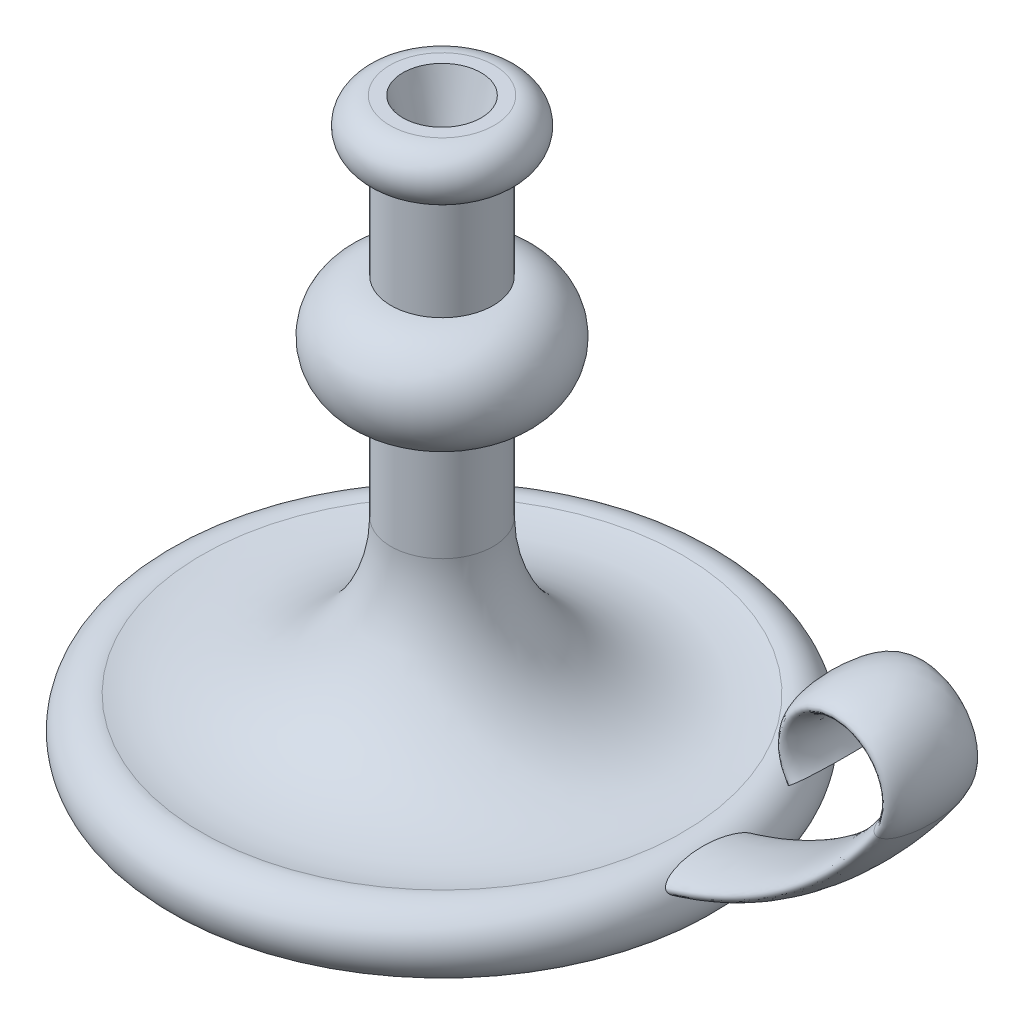
ISO-10303-21;
HEADER;
FILE_DESCRIPTION(('STEP AP214'),'2;1');
FILE_NAME('part.step','',(''),(''),'','','');
FILE_SCHEMA(('AUTOMOTIVE_DESIGN { 1 0 10303 214 1 1 1 1 }'));
ENDSEC;
DATA;
#1=APPLICATION_CONTEXT('core data for automotive mechanical design processes');
#2=APPLICATION_PROTOCOL_DEFINITION('international standard','automotive_design',2000,#1);
#3=PRODUCT_CONTEXT('',#1,'mechanical');
#4=PRODUCT('Part','Part','',(#3));
#5=PRODUCT_RELATED_PRODUCT_CATEGORY('part','',(#4));
#6=PRODUCT_DEFINITION_FORMATION('','',#4);
#7=PRODUCT_DEFINITION_CONTEXT('part definition',#1,'design');
#8=PRODUCT_DEFINITION('design','',#6,#7);
#9=PRODUCT_DEFINITION_SHAPE('','',#8);
#10=(LENGTH_UNIT() NAMED_UNIT(*) SI_UNIT(.MILLI.,.METRE.));
#11=(NAMED_UNIT(*) PLANE_ANGLE_UNIT() SI_UNIT($,.RADIAN.));
#12=(NAMED_UNIT(*) SI_UNIT($,.STERADIAN.) SOLID_ANGLE_UNIT());
#13=UNCERTAINTY_MEASURE_WITH_UNIT(LENGTH_MEASURE(1.E-05),#10,'distance_accuracy_value','');
#14=(GEOMETRIC_REPRESENTATION_CONTEXT(3) GLOBAL_UNCERTAINTY_ASSIGNED_CONTEXT((#13)) GLOBAL_UNIT_ASSIGNED_CONTEXT((#10,
#11,#12)) REPRESENTATION_CONTEXT('',''));
#15=CARTESIAN_POINT('',(0.,0.,0.));
#16=DIRECTION('',(0.,0.,1.));
#17=DIRECTION('',(1.,0.,0.));
#18=AXIS2_PLACEMENT_3D('',#15,#16,#17);
#19=CARTESIAN_POINT('',(0.,0.,0.));
#20=DIRECTION('',(0.,-1.,0.));
#21=DIRECTION('',(0.,0.,-1.));
#22=AXIS2_PLACEMENT_3D('',#19,#20,#21);
#23=PLANE('',#22);
#24=CARTESIAN_POINT('',(0.,0.,0.));
#25=DIRECTION('',(0.,-1.,0.));
#26=DIRECTION('',(0.,0.,-1.));
#27=AXIS2_PLACEMENT_3D('',#24,#25,#26);
#28=CIRCLE('',#27,103.316912972085);
#29=CARTESIAN_POINT('',(0.,0.,-103.316912972085));
#30=VERTEX_POINT('',#29);
#31=EDGE_CURVE('E50',#30,#30,#28,.T.);
#32=ORIENTED_EDGE('',*,*,#31,.T.);
#33=EDGE_LOOP('',(#32));
#34=FACE_BOUND('',#33,.T.);
#35=ADVANCED_FACE('F33',(#34),#23,.T.);
#36=CARTESIAN_POINT('',(0.,220.,0.));
#37=DIRECTION('',(0.,1.,0.));
#38=DIRECTION('',(0.,0.,1.));
#39=AXIS2_PLACEMENT_3D('',#36,#37,#38);
#40=PLANE('',#39);
#41=CARTESIAN_POINT('',(0.,220.,0.));
#42=DIRECTION('',(0.,1.,0.));
#43=DIRECTION('',(0.,0.,1.));
#44=AXIS2_PLACEMENT_3D('',#41,#42,#43);
#45=CIRCLE('',#44,15.);
#46=CARTESIAN_POINT('',(0.,220.,15.));
#47=VERTEX_POINT('',#46);
#48=EDGE_CURVE('E145',#47,#47,#45,.T.);
#49=ORIENTED_EDGE('',*,*,#48,.F.);
#50=EDGE_LOOP('',(#49));
#51=FACE_BOUND('',#50,.T.);
#52=CARTESIAN_POINT('',(0.,220.,0.));
#53=DIRECTION('',(0.,-1.,0.));
#54=DIRECTION('',(0.,0.,-1.));
#55=AXIS2_PLACEMENT_3D('',#52,#53,#54);
#56=CIRCLE('',#55,20.);
#57=CARTESIAN_POINT('',(0.,220.,-20.));
#58=VERTEX_POINT('',#57);
#59=EDGE_CURVE('E43',#58,#58,#56,.T.);
#60=ORIENTED_EDGE('',*,*,#59,.F.);
#61=EDGE_LOOP('',(#60));
#62=FACE_BOUND('',#61,.T.);
#63=ADVANCED_FACE('F80',(#51,#62),#40,.T.);
#64=CARTESIAN_POINT('',(0.,210.,0.));
#65=DIRECTION('',(0.,-1.,0.));
#66=DIRECTION('',(0.,0.,-1.));
#67=AXIS2_PLACEMENT_3D('',#64,#65,#66);
#68=TOROIDAL_SURFACE('',#67,20.,10.);
#69=ORIENTED_EDGE('',*,*,#59,.T.);
#70=EDGE_LOOP('',(#69));
#71=FACE_BOUND('',#70,.T.);
#72=CARTESIAN_POINT('',(0.,200.008061282712,0.));
#73=DIRECTION('',(0.,-1.,0.));
#74=DIRECTION('',(0.,0.,-1.));
#75=AXIS2_PLACEMENT_3D('',#72,#73,#74);
#76=CIRCLE('',#75,19.5985517842088);
#77=CARTESIAN_POINT('',(0.,200.008061282712,-19.5985517842088));
#78=VERTEX_POINT('',#77);
#79=EDGE_CURVE('E72',#78,#78,#76,.T.);
#80=ORIENTED_EDGE('',*,*,#79,.F.);
#81=EDGE_LOOP('',(#80));
#82=FACE_BOUND('',#81,.T.);
#83=ADVANCED_FACE('F77',(#71,#82),#68,.T.);
#84=CARTESIAN_POINT('',(0.,0.,0.));
#85=DIRECTION('',(0.,-1.,0.));
#86=DIRECTION('',(0.,0.,-1.));
#87=AXIS2_PLACEMENT_3D('',#84,#85,#86);
#88=CYLINDRICAL_SURFACE('',#87,19.5985517842088);
#89=ORIENTED_EDGE('',*,*,#79,.T.);
#90=EDGE_LOOP('',(#89));
#91=FACE_BOUND('',#90,.T.);
#92=CARTESIAN_POINT('',(0.,160.008061282712,0.));
#93=DIRECTION('',(0.,-1.,0.));
#94=DIRECTION('',(0.,0.,-1.));
#95=AXIS2_PLACEMENT_3D('',#92,#93,#94);
#96=CIRCLE('',#95,19.5985517842088);
#97=CARTESIAN_POINT('',(0.,160.008061282712,-19.5985517842088));
#98=VERTEX_POINT('',#97);
#99=EDGE_CURVE('E69',#98,#98,#96,.T.);
#100=ORIENTED_EDGE('',*,*,#99,.F.);
#101=EDGE_LOOP('',(#100));
#102=FACE_BOUND('',#101,.T.);
#103=ADVANCED_FACE('F87',(#91,#102),#88,.T.);
#104=CARTESIAN_POINT('',(0.,140.008061282712,0.));
#105=DIRECTION('',(0.,-1.,0.));
#106=DIRECTION('',(0.,0.,-1.));
#107=AXIS2_PLACEMENT_3D('',#104,#105,#106);
#108=DEGENERATE_TOROIDAL_SURFACE('',#107,19.5985517842088,20.,.T.);
#109=ORIENTED_EDGE('',*,*,#99,.T.);
#110=EDGE_LOOP('',(#109));
#111=FACE_BOUND('',#110,.T.);
#112=CARTESIAN_POINT('',(0.,120.008061282712,0.));
#113=DIRECTION('',(0.,-1.,0.));
#114=DIRECTION('',(0.,0.,-1.));
#115=AXIS2_PLACEMENT_3D('',#112,#113,#114);
#116=CIRCLE('',#115,19.5985517842088);
#117=CARTESIAN_POINT('',(0.,120.008061282712,-19.5985517842088));
#118=VERTEX_POINT('',#117);
#119=EDGE_CURVE('E66',#118,#118,#116,.T.);
#120=ORIENTED_EDGE('',*,*,#119,.F.);
#121=EDGE_LOOP('',(#120));
#122=FACE_BOUND('',#121,.T.);
#123=ADVANCED_FACE('F94',(#111,#122),#108,.T.);
#124=CARTESIAN_POINT('',(0.,0.,0.));
#125=DIRECTION('',(0.,-1.,0.));
#126=DIRECTION('',(0.,0.,-1.));
#127=AXIS2_PLACEMENT_3D('',#124,#125,#126);
#128=CYLINDRICAL_SURFACE('',#127,19.5985517842088);
#129=ORIENTED_EDGE('',*,*,#119,.T.);
#130=EDGE_LOOP('',(#129));
#131=FACE_BOUND('',#130,.T.);
#132=CARTESIAN_POINT('',(0.,80.008061282712,0.));
#133=DIRECTION('',(0.,-1.,0.));
#134=DIRECTION('',(0.,0.,-1.));
#135=AXIS2_PLACEMENT_3D('',#132,#133,#134);
#136=CIRCLE('',#135,19.5985517842088);
#137=CARTESIAN_POINT('',(0.,80.008061282712,-19.5985517842088));
#138=VERTEX_POINT('',#137);
#139=EDGE_CURVE('E63',#138,#138,#136,.T.);
#140=ORIENTED_EDGE('',*,*,#139,.F.);
#141=EDGE_LOOP('',(#140));
#142=FACE_BOUND('',#141,.T.);
#143=ADVANCED_FACE('F98',(#131,#142),#128,.T.);
#144=CARTESIAN_POINT('',(0.,80.0080612827121,0.));
#145=DIRECTION('',(0.,-1.,0.));
#146=DIRECTION('',(0.,0.,-1.));
#147=AXIS2_PLACEMENT_3D('',#144,#145,#146);
#148=TOROIDAL_SURFACE('',#147,79.5985517842088,60.);
#149=ORIENTED_EDGE('',*,*,#139,.T.);
#150=EDGE_LOOP('',(#149));
#151=FACE_BOUND('',#150,.T.);
#152=CARTESIAN_POINT('',(0.,21.334474768236,0.));
#153=DIRECTION('',(0.,-1.,0.));
#154=DIRECTION('',(0.,0.,-1.));
#155=AXIS2_PLACEMENT_3D('',#152,#153,#154);
#156=CIRCLE('',#155,92.1448757688783);
#157=CARTESIAN_POINT('',(0.,21.334474768236,-92.1448757688783));
#158=VERTEX_POINT('',#157);
#159=EDGE_CURVE('E54',#158,#158,#156,.T.);
#160=ORIENTED_EDGE('',*,*,#159,.F.);
#161=EDGE_LOOP('',(#160));
#162=FACE_BOUND('',#161,.T.);
#163=ADVANCED_FACE('F102',(#151,#162),#148,.F.);
#164=CARTESIAN_POINT('',(0.,9.11081091105351,0.));
#165=DIRECTION('',(0.,-1.,0.));
#166=DIRECTION('',(0.,0.,-1.));
#167=AXIS2_PLACEMENT_3D('',#164,#165,#166);
#168=TOROIDAL_SURFACE('',#167,94.7586932656845,12.5);
#169=CARTESIAN_POINT('',(103.426266730433,16.4236810687177,-17.5));
#170=CARTESIAN_POINT('',(103.397269027775,16.463316378507,-17.5000027204003));
#171=CARTESIAN_POINT('',(103.368293788167,16.5029522137003,-17.4977396373189));
#172=CARTESIAN_POINT('',(103.310598700613,16.5819120229062,-17.4887733293129));
#173=CARTESIAN_POINT('',(103.281878904488,16.6212359334727,-17.482069223381));
#174=CARTESIAN_POINT('',(103.196372047125,16.7383326956763,-17.4555385289255));
#175=CARTESIAN_POINT('',(103.140260272071,16.8151994351432,-17.4292937889514));
#176=CARTESIAN_POINT('',(103.015609748354,16.9857964370289,-17.3528768518307));
#177=CARTESIAN_POINT('',(102.948073526571,17.0781078578915,-17.2980232574553));
#178=CARTESIAN_POINT('',(102.818708637101,17.2544090594567,-17.1709984554719));
#179=CARTESIAN_POINT('',(102.756892890607,17.3383800309684,-17.0987893074066));
#180=CARTESIAN_POINT('',(102.646223440756,17.4880641679665,-16.9522633950317));
#181=CARTESIAN_POINT('',(102.596721606566,17.5547405587344,-16.8793865390805));
#182=CARTESIAN_POINT('',(102.501317376787,17.6826479266324,-16.7267565624448));
#183=CARTESIAN_POINT('',(102.455417980281,17.7438743721703,-16.6469978260516));
#184=CARTESIAN_POINT('',(102.366669057382,17.861624856974,-16.4821656614054));
#185=CARTESIAN_POINT('',(102.323827314502,17.9181369531157,-16.3970796370681));
#186=CARTESIAN_POINT('',(102.240892600228,18.0268841083852,-16.2230006309145));
#187=CARTESIAN_POINT('',(102.20079872388,18.0791205767162,-16.1340089513387));
#188=CARTESIAN_POINT('',(102.123361622276,18.1793604534935,-15.9538516229895));
#189=CARTESIAN_POINT('',(102.085994992371,18.2274008176284,-15.862716425842));
#190=CARTESIAN_POINT('',(102.013279226942,18.3202544146931,-15.6780212762858));
#191=CARTESIAN_POINT('',(101.977930435079,18.3650670982511,-15.5844609147667));
#192=CARTESIAN_POINT('',(101.874430290289,18.495344772413,-15.3005590379703));
#193=CARTESIAN_POINT('',(101.808938159428,18.5765033716367,-15.1072661773267));
#194=CARTESIAN_POINT('',(101.68353129244,18.7296038666987,-14.7151797783787));
#195=CARTESIAN_POINT('',(101.623621353623,18.8015378545612,-14.5163816957818));
#196=CARTESIAN_POINT('',(101.508171044834,18.9379973073709,-14.1139806525515));
#197=CARTESIAN_POINT('',(101.452651122625,19.0024886806834,-13.9103603606587));
#198=CARTESIAN_POINT('',(101.345613790074,19.1248107821751,-13.5003692184341));
#199=CARTESIAN_POINT('',(101.294092050806,19.1826487478438,-13.2940016346093));
#200=CARTESIAN_POINT('',(101.19448293199,19.2926263123995,-12.8790016001586));
#201=CARTESIAN_POINT('',(101.146394707163,19.3447673154787,-12.6703697216387));
#202=CARTESIAN_POINT('',(101.045067004893,19.4528080053435,-12.2143560424825));
#203=CARTESIAN_POINT('',(100.992411292707,19.5077531032332,-11.9666192078632));
#204=CARTESIAN_POINT('',(100.890887417472,19.6116376131444,-11.4691099180631));
#205=CARTESIAN_POINT('',(100.842019539576,19.6605765731779,-11.219337311188));
#206=CARTESIAN_POINT('',(100.747769000577,19.7531545475027,-10.7180433319723));
#207=CARTESIAN_POINT('',(100.702387901273,19.7967911918083,-10.4665212303728));
#208=CARTESIAN_POINT('',(100.614949671447,19.8792887281544,-9.9621158572137));
#209=CARTESIAN_POINT('',(100.572892682826,19.9181494163573,-9.70923252803747));
#210=CARTESIAN_POINT('',(100.451783826594,20.0280246589682,-8.95050446077015));
#211=CARTESIAN_POINT('',(100.377491351028,20.092625216391,-8.44295862786832));
#212=CARTESIAN_POINT('',(100.241315995894,20.2073850333109,-7.42458093626869));
#213=CARTESIAN_POINT('',(100.179433909812,20.2575433695031,-6.91374886961223));
#214=CARTESIAN_POINT('',(100.096128769927,20.3232918256759,-6.14621311435612));
#215=CARTESIAN_POINT('',(100.069968310303,20.3436107538037,-5.89041171021286));
#216=CARTESIAN_POINT('',(100.020838245978,20.3812851644509,-5.37830363237506));
#217=CARTESIAN_POINT('',(99.9978684122739,20.3986408596733,-5.1219969962835));
#218=CARTESIAN_POINT('',(99.9338188592132,20.4465042050169,-4.35237405832747));
#219=CARTESIAN_POINT('',(99.8976016024752,20.4728061668091,-3.83837782229187));
#220=CARTESIAN_POINT('',(99.8385704386688,20.5151096031763,-2.80896721877596));
#221=CARTESIAN_POINT('',(99.815762729484,20.5311063149984,-2.29355230598237));
#222=CARTESIAN_POINT('',(99.7839247970312,20.5533159164935,-1.26209443794372));
#223=CARTESIAN_POINT('',(99.7748942885946,20.5595290086737,-0.746051495919245));
#224=CARTESIAN_POINT('',(99.7707625480538,20.5623800825022,0.285979152847147));
#225=CARTESIAN_POINT('',(99.775657633349,20.559020595603,0.801966838112897));
#226=CARTESIAN_POINT('',(99.7992859696937,20.5426194903898,1.8334828307293));
#227=CARTESIAN_POINT('',(99.8180195056095,20.5295776727638,2.34901112840467));
#228=CARTESIAN_POINT('',(99.869025492416,20.4933751965346,3.37898886111217));
#229=CARTESIAN_POINT('',(99.9012965975955,20.4702155436921,3.89343839827218));
#230=CARTESIAN_POINT('',(99.978943306834,20.412996207485,4.92072664822215));
#231=CARTESIAN_POINT('',(100.024318273987,20.3789370538758,5.43356543807724));
#232=CARTESIAN_POINT('',(100.111004309299,20.3117017632972,6.29141281224848));
#233=CARTESIAN_POINT('',(100.148879454705,20.2818060114869,6.63703175681123));
#234=CARTESIAN_POINT('',(100.230331590307,20.2159790171395,7.32701952039132));
#235=CARTESIAN_POINT('',(100.273908452677,20.1800479099034,7.67138836725669));
#236=CARTESIAN_POINT('',(100.366715409076,20.101542158752,8.35847890378055));
#237=CARTESIAN_POINT('',(100.415943462604,20.0589699108009,8.70120114170874));
#238=CARTESIAN_POINT('',(100.520133054679,19.9663853347988,9.38476334121921));
#239=CARTESIAN_POINT('',(100.575094387713,19.9163732734026,9.72560336980896));
#240=CARTESIAN_POINT('',(100.677014088296,19.8209597702579,10.323063917175));
#241=CARTESIAN_POINT('',(100.722709344399,19.7773515157925,10.5801866669277));
#242=CARTESIAN_POINT('',(100.817717660682,19.6846928513083,11.0927745726166));
#243=CARTESIAN_POINT('',(100.867030569689,19.6356426686483,11.348239797331));
#244=CARTESIAN_POINT('',(100.969597448888,19.531353490375,11.8573209261919));
#245=CARTESIAN_POINT('',(101.022854331221,19.4761099059115,12.1109353088327));
#246=CARTESIAN_POINT('',(101.13369733211,19.3585639025338,12.6155599153797));
#247=CARTESIAN_POINT('',(101.191282968465,19.2962622694602,12.8665704258098));
#248=CARTESIAN_POINT('',(101.291544708287,19.1853816696112,13.2826923171309));
#249=CARTESIAN_POINT('',(101.33284884938,19.1390838133859,13.448742685507));
#250=CARTESIAN_POINT('',(101.417955829538,19.0423162713613,13.7790100910031));
#251=CARTESIAN_POINT('',(101.461758982197,18.9918460616252,13.9432268949282));
#252=CARTESIAN_POINT('',(101.55222997361,18.8861354037197,14.2694495040369));
#253=CARTESIAN_POINT('',(101.598899565364,18.8308920279011,14.4314538806599));
#254=CARTESIAN_POINT('',(101.695642450451,18.7148052528743,14.7528675305471));
#255=CARTESIAN_POINT('',(101.745723034638,18.6539497531057,14.9122702808969));
#256=CARTESIAN_POINT('',(101.849784734008,18.5258275728738,15.227106896501));
#257=CARTESIAN_POINT('',(101.903763981255,18.4585639578177,15.3825426147669));
#258=CARTESIAN_POINT('',(102.016422360045,18.3164253276209,15.6880001825387));
#259=CARTESIAN_POINT('',(102.075096672158,18.241558096774,15.8380273600294));
#260=CARTESIAN_POINT('',(102.183547382769,18.1015813085526,16.0955043221229));
#261=CARTESIAN_POINT('',(102.232083547579,18.038436952378,16.2045370831579));
#262=CARTESIAN_POINT('',(102.333263768204,17.9057614238499,16.4168598886759));
#263=CARTESIAN_POINT('',(102.385911009762,17.8362252908603,16.5201453712018));
#264=CARTESIAN_POINT('',(102.495622517432,17.6903050018945,16.7177791494335));
#265=CARTESIAN_POINT('',(102.552646452482,17.6139825397244,16.8121945669929));
#266=CARTESIAN_POINT('',(102.672285665462,17.452930164333,16.9894770290263));
#267=CARTESIAN_POINT('',(102.734888442554,17.3682190029983,17.0723688778794));
#268=CARTESIAN_POINT('',(102.851846979412,17.2092931036569,17.2050196439126));
#269=CARTESIAN_POINT('',(102.90495253331,17.1369171394966,17.2580496288019));
#270=CARTESIAN_POINT('',(103.015069116115,16.9865355209552,17.3507488476699));
#271=CARTESIAN_POINT('',(103.072078913573,16.9085316412797,17.3904222713359));
#272=CARTESIAN_POINT('',(103.160240863489,16.7878229973279,17.4373197736977));
#273=CARTESIAN_POINT('',(103.190259852742,16.7467085435173,17.4508933252382));
#274=CARTESIAN_POINT('',(103.250905159123,16.6636515259587,17.4732803632079));
#275=CARTESIAN_POINT('',(103.28153115928,16.621709394459,17.4820962694746));
#276=CARTESIAN_POINT('',(103.3431399908,16.5373708591327,17.4946697444343));
#277=CARTESIAN_POINT('',(103.374122579555,16.4949747653913,17.4984305684184));
#278=CARTESIAN_POINT('',(103.436185968198,16.4101129676613,17.5007726207508));
#279=CARTESIAN_POINT('',(103.467266759927,16.3676472695897,17.4993542686517));
#280=CARTESIAN_POINT('',(103.525771505066,16.2877993863939,17.4918389741755));
#281=CARTESIAN_POINT('',(103.553215652225,16.2503798604789,17.4862830608146));
#282=CARTESIAN_POINT('',(103.607776509149,16.1760763300611,17.4712900185556));
#283=CARTESIAN_POINT('',(103.634893112261,16.139192499238,17.4618516587666));
#284=CARTESIAN_POINT('',(103.715513133278,16.029688414833,17.4280519421525));
#285=CARTESIAN_POINT('',(103.768300387542,15.9581969613617,17.3982040149427));
#286=CARTESIAN_POINT('',(103.893484134258,15.7892376308359,17.3107443631975));
#287=CARTESIAN_POINT('',(103.964383342627,15.6940511542135,17.2467007956413));
#288=CARTESIAN_POINT('',(104.099925586931,15.5130856769054,17.1010394847144));
#289=CARTESIAN_POINT('',(104.164549590836,15.4273351958757,17.0193705596786));
#290=CARTESIAN_POINT('',(104.282308812361,15.2719887198903,16.8520354204313));
#291=CARTESIAN_POINT('',(104.335954318402,15.2016326908719,16.7674119214487));
#292=CARTESIAN_POINT('',(104.439060154809,15.0671373409159,16.5909131336467));
#293=CARTESIAN_POINT('',(104.488516653718,15.0030037036296,16.4990313513699));
#294=CARTESIAN_POINT('',(104.583854015246,14.8800348506832,16.3097907535667));
#295=CARTESIAN_POINT('',(104.629728274734,14.8212093899137,16.2124223678276));
#296=CARTESIAN_POINT('',(104.718285239137,14.708249497945,16.013675714403));
#297=CARTESIAN_POINT('',(104.760968946401,14.654113592612,15.9122987215004));
#298=CARTESIAN_POINT('',(104.849782907617,14.5420495596676,15.6909268046193));
#299=CARTESIAN_POINT('',(104.895466593179,14.4847748689263,15.5704241702876));
#300=CARTESIAN_POINT('',(104.983681546239,14.3748068757641,15.3262195055494));
#301=CARTESIAN_POINT('',(105.026212418054,14.3221141482421,15.2025170761836));
#302=CARTESIAN_POINT('',(105.108444216181,14.2207937759595,14.9528032460934));
#303=CARTESIAN_POINT('',(105.148149679007,14.1721595920157,14.8267959746771));
#304=CARTESIAN_POINT('',(105.225117926284,14.0783801369926,14.5727722009018));
#305=CARTESIAN_POINT('',(105.262380859199,14.0332346538317,14.4447558212487));
#306=CARTESIAN_POINT('',(105.347105330629,13.9311066179654,14.1429615539003));
#307=CARTESIAN_POINT('',(105.393691662149,13.8753620478979,13.9685194138759));
#308=CARTESIAN_POINT('',(105.483418469447,13.7686766679192,13.6172838701517));
#309=CARTESIAN_POINT('',(105.526558478966,13.7177365078378,13.440490152064));
#310=CARTESIAN_POINT('',(105.609805305499,13.6200262370194,13.0848368330723));
#311=CARTESIAN_POINT('',(105.649908814756,13.57326066415,12.9059752171498));
#312=CARTESIAN_POINT('',(105.727326985103,13.4834923238032,12.5467066223342));
#313=CARTESIAN_POINT('',(105.764641474097,13.4404897884972,12.3662995488426));
#314=CARTESIAN_POINT('',(105.872802042634,13.3165010796512,11.8229949827269));
#315=CARTESIAN_POINT('',(105.939828567529,13.240576634711,11.4581732123538));
#316=CARTESIAN_POINT('',(106.065415415038,13.0995908398837,10.7230875471275));
#317=CARTESIAN_POINT('',(106.123931465323,13.0345860415106,10.3528055103551));
#318=CARTESIAN_POINT('',(106.233027561043,12.9143467277316,9.60979384232904));
#319=CARTESIAN_POINT('',(106.283613384244,12.859105095353,9.2370662011071));
#320=CARTESIAN_POINT('',(106.37758784517,12.7571785663278,8.48961212987622));
#321=CARTESIAN_POINT('',(106.42097758457,12.7104923597829,8.11488601490468));
#322=CARTESIAN_POINT('',(106.498311130054,12.6277638932862,7.38976660413014));
#323=CARTESIAN_POINT('',(106.532700158882,12.5912094353011,7.03947866741293));
#324=CARTESIAN_POINT('',(106.595988760591,12.5242440515384,6.33781707855791));
#325=CARTESIAN_POINT('',(106.624888126365,12.4938333575415,5.98644338596624));
#326=CARTESIAN_POINT('',(106.703723577752,12.4111775018163,4.93090955827087));
#327=CARTESIAN_POINT('',(106.745783800592,12.367522583066,4.2254625025432));
#328=CARTESIAN_POINT('',(106.810017529666,12.3010844943769,2.81470459304569));
#329=CARTESIAN_POINT('',(106.83224580151,12.2782438424201,2.10939877522954));
#330=CARTESIAN_POINT('',(106.857571378728,12.2522321210181,0.698167411329047));
#331=CARTESIAN_POINT('',(106.860671430198,12.249058228163,-0.00775803124629848));
#332=CARTESIAN_POINT('',(106.850000505882,12.2600100880334,-1.17921016494105));
#333=CARTESIAN_POINT('',(106.841608242769,12.2686199100988,-1.64485236224872));
#334=CARTESIAN_POINT('',(106.816427151594,12.2945248638375,-2.57566637530312));
#335=CARTESIAN_POINT('',(106.799638518293,12.3118197940538,-3.04083820170966));
#336=CARTESIAN_POINT('',(106.757470692879,12.3554344884873,-3.97055382272103));
#337=CARTESIAN_POINT('',(106.732088120651,12.3817578037476,-4.4350972978969));
#338=CARTESIAN_POINT('',(106.672431791985,12.4439624429258,-5.3629690067159));
#339=CARTESIAN_POINT('',(106.638158344665,12.4798434345446,-5.82629728204334));
#340=CARTESIAN_POINT('',(106.571902466304,12.5496913553013,-6.61305586938988));
#341=CARTESIAN_POINT('',(106.542295284656,12.5810268904458,-6.93692241518866));
#342=CARTESIAN_POINT('',(106.478269221739,12.6491627344655,-7.58360136238959));
#343=CARTESIAN_POINT('',(106.44385045936,12.685962908314,-7.90641378963682));
#344=CARTESIAN_POINT('',(106.369943081655,12.7654808054506,-8.5505676630202));
#345=CARTESIAN_POINT('',(106.330456960132,12.8081956187744,-8.8719097527264));
#346=CARTESIAN_POINT('',(106.246043890667,12.9001618047029,-9.51293955876198));
#347=CARTESIAN_POINT('',(106.201117139896,12.9494129404341,-9.83262733460698));
#348=CARTESIAN_POINT('',(106.11951844071,13.0395858554011,-10.3755890812921));
#349=CARTESIAN_POINT('',(106.084338668067,13.0786587371043,-10.5993953422548));
#350=CARTESIAN_POINT('',(106.010831273147,13.160792884775,-11.0457534181776));
#351=CARTESIAN_POINT('',(105.972503747889,13.2038540278247,-11.2683052715743));
#352=CARTESIAN_POINT('',(105.892400823009,13.2944366865694,-11.7120899835656));
#353=CARTESIAN_POINT('',(105.850622432289,13.34196207673,-11.9333215158527));
#354=CARTESIAN_POINT('',(105.763312397957,13.4419826111856,-12.3739131787332));
#355=CARTESIAN_POINT('',(105.717780870557,13.4944776016087,-12.5932733670392));
#356=CARTESIAN_POINT('',(105.622125538155,13.6056010622947,-13.031519473973));
#357=CARTESIAN_POINT('',(105.571965838019,13.664278080871,-13.2503853465152));
#358=CARTESIAN_POINT('',(105.466812567455,13.7883050689228,-13.68504181303));
#359=CARTESIAN_POINT('',(105.411819463315,13.8536543948054,-13.9008327013237));
#360=CARTESIAN_POINT('',(105.296274102938,13.9921844397436,-14.3281274110939));
#361=CARTESIAN_POINT('',(105.235727819613,14.0653567582272,-14.539635546826));
#362=CARTESIAN_POINT('',(105.107968770756,14.2212381394235,-14.9570314618605));
#363=CARTESIAN_POINT('',(105.040759015896,14.3039428979344,-15.1629217262768));
#364=CARTESIAN_POINT('',(104.934113416829,14.4365300709634,-15.4646873937406));
#365=CARTESIAN_POINT('',(104.897779505335,14.4819116788238,-15.5636434357823));
#366=CARTESIAN_POINT('',(104.82283579274,14.5759966711992,-15.759078203743));
#367=CARTESIAN_POINT('',(104.784226344099,14.6246995414625,-15.8555573100115));
#368=CARTESIAN_POINT('',(104.704397290963,14.7259278148932,-16.0455030344807));
#369=CARTESIAN_POINT('',(104.66317568594,14.7784561525154,-16.1389672590058));
#370=CARTESIAN_POINT('',(104.577788853548,14.8878516378872,-16.3219318272102));
#371=CARTESIAN_POINT('',(104.533624322763,14.9447177593494,-16.4114331006233));
#372=CARTESIAN_POINT('',(104.45332482805,15.0486798466345,-16.5636310900247));
#373=CARTESIAN_POINT('',(104.417925521736,15.0946871091599,-16.6274570741899));
#374=CARTESIAN_POINT('',(104.345020710829,15.1898286343045,-16.7514609866341));
#375=CARTESIAN_POINT('',(104.307515837757,15.2389619599069,-16.8116399976075));
#376=CARTESIAN_POINT('',(104.230243667327,15.3406068339389,-16.9273437976006));
#377=CARTESIAN_POINT('',(104.190480275401,15.3931125702006,-16.982876233451));
#378=CARTESIAN_POINT('',(104.108477910085,15.5018264767327,-17.0881402179593));
#379=CARTESIAN_POINT('',(104.066240548012,15.558032240036,-17.1378754806087));
#380=CARTESIAN_POINT('',(103.968883249859,15.6880837005506,-17.2409102657256));
#381=CARTESIAN_POINT('',(103.91307189245,15.7629665044606,-17.2922910390389));
#382=CARTESIAN_POINT('',(103.797745367662,15.9183675401614,-17.3801295867417));
#383=CARTESIAN_POINT('',(103.738238945277,15.9988725185386,-17.4166211562361));
#384=CARTESIAN_POINT('',(103.636380024039,16.1371474651415,-17.4621517598684));
#385=CARTESIAN_POINT('',(103.594746527409,16.1937910655717,-17.4762599405278));
#386=CARTESIAN_POINT('',(103.510815024174,16.3081831130282,-17.4951819658534));
#387=CARTESIAN_POINT('',(103.468517033738,16.3659315331791,-17.4999960363157));
#388=CARTESIAN_POINT('',(103.426266730433,16.4236810687177,-17.5));
#389=B_SPLINE_CURVE_WITH_KNOTS('',3,(#169,#170,#171,#172,#173,#174,#175,#176,#177,#178,#179,
#180,#181,#182,#183,#184,#185,#186,#187,#188,#189,#190,#191,#192,#193,#194,#195,#196,#197,#198,
#199,#200,#201,#202,#203,#204,#205,#206,#207,#208,#209,#210,#211,#212,#213,#214,#215,#216,#217,
#218,#219,#220,#221,#222,#223,#224,#225,#226,#227,#228,#229,#230,#231,#232,#233,#234,#235,#236,
#237,#238,#239,#240,#241,#242,#243,#244,#245,#246,#247,#248,#249,#250,#251,#252,#253,#254,#255,
#256,#257,#258,#259,#260,#261,#262,#263,#264,#265,#266,#267,#268,#269,#270,#271,#272,#273,#274,
#275,#276,#277,#278,#279,#280,#281,#282,#283,#284,#285,#286,#287,#288,#289,#290,#291,#292,#293,
#294,#295,#296,#297,#298,#299,#300,#301,#302,#303,#304,#305,#306,#307,#308,#309,#310,#311,#312,
#313,#314,#315,#316,#317,#318,#319,#320,#321,#322,#323,#324,#325,#326,#327,#328,#329,#330,#331,
#332,#333,#334,#335,#336,#337,#338,#339,#340,#341,#342,#343,#344,#345,#346,#347,#348,#349,#350,
#351,#352,#353,#354,#355,#356,#357,#358,#359,#360,#361,#362,#363,#364,#365,#366,#367,#368,#369,
#370,#371,#372,#373,#374,#375,#376,#377,#378,#379,#380,#381,#382,#383,#384,#385,#386,#387,#388),
.UNSPECIFIED.,.T.,.F.,(4,2,2,2,2,2,2,2,2,2,2,2,2,2,2,2,2,2,2,2,2,2,2,2,2,2,2,2,2,2,2,2,2,2,2,2,
2,2,2,2,2,2,2,2,2,2,2,2,2,2,2,2,2,2,2,2,2,2,2,2,2,2,2,2,2,2,2,2,2,2,2,2,2,2,2,2,2,2,2,2,2,2,2,2,
2,2,2,2,2,2,2,2,2,2,2,2,2,2,2,2,2,2,2,2,2,2,2,2,2,4),(0.,0.147253694078667,0.294536609012006,
0.589216454817124,0.9676767708968,1.34697207558169,1.6779564665065,2.00921354684322,
2.34128582987067,2.6732482208245,3.00190672488033,3.33062103715896,3.98902707539124,
4.64799382439439,5.30986834294594,5.97101593524086,6.63200019793815,7.40936285594839,
8.18678397805833,8.96455131718008,9.74235183987066,11.2929269025023,12.8436010728859,
13.6173800093452,14.391103380043,15.9386200262316,17.4868513723862,19.0350506718998,
20.5828405906893,22.1306623718136,23.6783303271262,25.2259230715584,26.2727471084855,
27.3195476807625,28.3659714622045,29.4123577471811,30.2065866186487,31.0007823204486,
31.7955704004451,32.5902700758382,33.121996829645,33.6537904559294,34.1859126084106,
34.719210186819,35.2522539240806,35.7847573494181,36.1895680201908,36.5946955593615,
36.9964572560053,37.397340311616,37.7093149868836,38.0211917105281,38.1790587068354,
38.3368453328451,38.4945303011884,38.6522024961366,38.7922395449649,38.9323210253996,
39.2124154145415,39.6147608706321,40.0182907935125,40.385042584658,40.7521262808137,
41.1198713874407,41.4875004729095,41.9103981370646,42.3333487858673,42.7556042557643,
43.1778340360843,43.744596332362,44.3114351775632,44.8788828707633,45.4463655496153,
46.5818366558235,47.723018125896,48.8633642562247,50.0035356450736,51.0650246913299,
52.1265537760301,54.249993483072,56.3675510322173,58.4848045723763,59.882058622431,
61.279280263734,62.6770520914634,64.0747753281463,65.0548725137725,66.0349454860034,
67.0145379707139,67.9940949651007,68.6837407397324,69.3733652666354,70.0635939397209,
70.7538012484818,71.4499025242462,72.1459367192443,72.8412308588645,73.5362122718353,
73.8804432230029,74.2246209952507,74.5690656195365,74.9134290020485,75.1721254971184,
75.4307448116393,75.6889297858781,75.9469484325993,76.2657279014349,76.5837797334825,
76.7983368818631,77.0128888176142),.UNSPECIFIED.);
#390=CARTESIAN_POINT('',(103.426266730433,16.4236810687177,-17.5));
#391=VERTEX_POINT('',#390);
#392=EDGE_CURVE('E11',#391,#391,#389,.T.);
#393=ORIENTED_EDGE('',*,*,#392,.F.);
#394=EDGE_LOOP('',(#393));
#395=FACE_BOUND('',#394,.T.);
#396=ORIENTED_EDGE('',*,*,#159,.T.);
#397=EDGE_LOOP('',(#396));
#398=FACE_BOUND('',#397,.T.);
#399=ORIENTED_EDGE('',*,*,#31,.F.);
#400=EDGE_LOOP('',(#399));
#401=FACE_BOUND('',#400,.T.);
#402=ADVANCED_FACE('F105',(#395,#398,#401),#168,.T.);
#403=CARTESIAN_POINT('',(150.634185358261,75.,0.));
#404=DIRECTION('',(0.566666666666666,-0.823947139620552,0.));
#405=DIRECTION('',(0.,0.,-1.));
#406=AXIS2_PLACEMENT_3D('',#403,#404,#405);
#407=PLANE('',#406);
#408=CARTESIAN_POINT('',(150.634185358261,75.,0.));
#409=DIRECTION('',(0.566666666666666,-0.823947139620552,0.));
#410=DIRECTION('',(0.,0.,-1.));
#411=AXIS2_PLACEMENT_3D('',#408,#409,#410);
#412=ELLIPSE('',#411,17.5,5.);
#413=CARTESIAN_POINT('',(150.634185358261,75.,-17.5));
#414=VERTEX_POINT('',#413);
#415=EDGE_CURVE('E47',#414,#414,#412,.T.);
#416=ORIENTED_EDGE('',*,*,#415,.T.);
#417=EDGE_LOOP('',(#416));
#418=FACE_BOUND('',#417,.T.);
#419=ADVANCED_FACE('F48',(#418),#407,.T.);
#420=CARTESIAN_POINT('',(60.,10.,-17.5));
#421=CARTESIAN_POINT('',(110.410191303973,10.,-17.5));
#422=CARTESIAN_POINT('',(155.026295870831,33.4646670673665,-17.5));
#423=CARTESIAN_POINT('',(183.592070943083,75.,-17.5));
#424=CARTESIAN_POINT('',(60.,20.,-17.5));
#425=CARTESIAN_POINT('',(107.049511883708,20.,-17.5));
#426=CARTESIAN_POINT('',(148.691209479443,41.9003559295421,-17.5));
#427=CARTESIAN_POINT('',(175.352599546877,80.6666666666666,-17.5));
#428=CARTESIAN_POINT('',(60.,20.,17.5));
#429=CARTESIAN_POINT('',(107.049511883708,20.,17.5));
#430=CARTESIAN_POINT('',(148.691209479443,41.9003559295421,17.5));
#431=CARTESIAN_POINT('',(175.352599546877,80.6666666666666,17.5));
#432=CARTESIAN_POINT('',(60.,10.,17.5));
#433=CARTESIAN_POINT('',(110.410191303973,10.,17.5));
#434=CARTESIAN_POINT('',(155.026295870831,33.4646670673665,17.5));
#435=CARTESIAN_POINT('',(183.592070943083,75.,17.5));
#436=CARTESIAN_POINT('',(60.,0.,17.5));
#437=CARTESIAN_POINT('',(113.770870724238,0.,17.5));
#438=CARTESIAN_POINT('',(161.36138226222,25.0289782051909,17.5));
#439=CARTESIAN_POINT('',(191.831542339288,69.3333333333333,17.5));
#440=CARTESIAN_POINT('',(60.,0.,-17.5));
#441=CARTESIAN_POINT('',(113.770870724238,0.,-17.5));
#442=CARTESIAN_POINT('',(161.36138226222,25.0289782051909,-17.5));
#443=CARTESIAN_POINT('',(191.831542339288,69.3333333333333,-17.5));
#444=CARTESIAN_POINT('',(60.,10.,-17.5));
#445=CARTESIAN_POINT('',(110.410191303973,10.,-17.5));
#446=CARTESIAN_POINT('',(155.026295870831,33.4646670673665,-17.5));
#447=CARTESIAN_POINT('',(183.592070943083,75.,-17.5));
#448=(BOUNDED_SURFACE() B_SPLINE_SURFACE(3,3,((#420,#421,#422,#423),(#424,#425,#426,#427),(#428,
#429,#430,#431),(#432,#433,#434,#435),(#436,#437,#438,#439),(#440,#441,#442,#443),(#444,#445,
#446,#447)),.UNSPECIFIED.,.T.,.F.,.F.) B_SPLINE_SURFACE_WITH_KNOTS((4,3,4),(4,4),(0.,0.5,1.),
(0.,1.),.UNSPECIFIED.) GEOMETRIC_REPRESENTATION_ITEM() RATIONAL_B_SPLINE_SURFACE(((1.,
0.923374135437856,0.923374135437856,1.),(0.333333333333333,0.307791378479285,0.307791378479285,
0.333333333333333),(0.333333333333333,0.307791378479285,0.307791378479285,0.333333333333333),
(1.,0.923374135437856,0.923374135437856,1.),(0.333333333333333,0.307791378479285,
0.307791378479285,0.333333333333333),(0.333333333333333,0.307791378479285,0.307791378479285,
0.333333333333333),(1.,0.923374135437856,0.923374135437856,1.))) REPRESENTATION_ITEM('') SURFACE());
#449=CARTESIAN_POINT('',(183.592070943083,75.,0.));
#450=DIRECTION('',(0.566666666666667,0.823947139620552,0.));
#451=DIRECTION('',(0.,0.,-1.));
#452=AXIS2_PLACEMENT_3D('',#449,#450,#451);
#453=ELLIPSE('',#452,17.5,5.);
#454=CARTESIAN_POINT('',(183.592070943083,75.,-17.5));
#455=VERTEX_POINT('',#454);
#456=EDGE_CURVE('E51',#455,#455,#453,.T.);
#457=ORIENTED_EDGE('',*,*,#392,.T.);
#458=EDGE_LOOP('',(#457));
#459=FACE_BOUND('',#458,.T.);
#460=ORIENTED_EDGE('',*,*,#456,.F.);
#461=EDGE_LOOP('',(#460));
#462=FACE_BOUND('',#461,.T.);
#463=ADVANCED_FACE('F114',(#459,#462),#448,.T.);
#464=CARTESIAN_POINT('',(183.592070943083,75.,-17.5));
#465=CARTESIAN_POINT('',(193.981461744242,90.10642735238,-17.5));
#466=CARTESIAN_POINT('',(185.447347211541,106.333333333333,-17.5));
#467=CARTESIAN_POINT('',(167.113128150672,106.333333333333,-17.5));
#468=CARTESIAN_POINT('',(148.778909089802,106.333333333333,-17.5));
#469=CARTESIAN_POINT('',(140.244794557101,90.1064273523801,-17.5));
#470=CARTESIAN_POINT('',(150.634185358261,75.,-17.5));
#471=CARTESIAN_POINT('',(175.352599546877,80.6666666666667,-17.5));
#472=CARTESIAN_POINT('',(180.547294947457,88.2198803428567,-17.5));
#473=CARTESIAN_POINT('',(176.280237681107,96.3333333333333,-17.5));
#474=CARTESIAN_POINT('',(167.113128150672,96.3333333333333,-17.5));
#475=CARTESIAN_POINT('',(157.946018620237,96.3333333333333,-17.5));
#476=CARTESIAN_POINT('',(153.678961353887,88.2198803428567,-17.5));
#477=CARTESIAN_POINT('',(158.873656754466,80.6666666666667,-17.5));
#478=CARTESIAN_POINT('',(175.352599546877,80.6666666666667,17.5));
#479=CARTESIAN_POINT('',(180.547294947457,88.2198803428567,17.5));
#480=CARTESIAN_POINT('',(176.280237681107,96.3333333333333,17.5));
#481=CARTESIAN_POINT('',(167.113128150672,96.3333333333333,17.5));
#482=CARTESIAN_POINT('',(157.946018620237,96.3333333333333,17.5));
#483=CARTESIAN_POINT('',(153.678961353887,88.2198803428567,17.5));
#484=CARTESIAN_POINT('',(158.873656754466,80.6666666666667,17.5));
#485=CARTESIAN_POINT('',(183.592070943083,75.,17.5));
#486=CARTESIAN_POINT('',(193.981461744242,90.10642735238,17.5));
#487=CARTESIAN_POINT('',(185.447347211541,106.333333333333,17.5));
#488=CARTESIAN_POINT('',(167.113128150672,106.333333333333,17.5));
#489=CARTESIAN_POINT('',(148.778909089802,106.333333333333,17.5));
#490=CARTESIAN_POINT('',(140.244794557101,90.1064273523801,17.5));
#491=CARTESIAN_POINT('',(150.634185358261,75.,17.5));
#492=CARTESIAN_POINT('',(191.831542339288,69.3333333333333,17.5));
#493=CARTESIAN_POINT('',(207.415628541028,91.9929743619034,17.5));
#494=CARTESIAN_POINT('',(194.614456741976,116.333333333333,17.5));
#495=CARTESIAN_POINT('',(167.113128150672,116.333333333333,17.5));
#496=CARTESIAN_POINT('',(139.611799559367,116.333333333333,17.5));
#497=CARTESIAN_POINT('',(126.810627760316,91.9929743619035,17.5));
#498=CARTESIAN_POINT('',(142.394713962055,69.3333333333334,17.5));
#499=CARTESIAN_POINT('',(191.831542339288,69.3333333333333,-17.5));
#500=CARTESIAN_POINT('',(207.415628541028,91.9929743619034,-17.5));
#501=CARTESIAN_POINT('',(194.614456741976,116.333333333333,-17.5));
#502=CARTESIAN_POINT('',(167.113128150672,116.333333333333,-17.5));
#503=CARTESIAN_POINT('',(139.611799559367,116.333333333333,-17.5));
#504=CARTESIAN_POINT('',(126.810627760316,91.9929743619035,-17.5));
#505=CARTESIAN_POINT('',(142.394713962055,69.3333333333334,-17.5));
#506=CARTESIAN_POINT('',(183.592070943083,75.,-17.5));
#507=CARTESIAN_POINT('',(193.981461744242,90.10642735238,-17.5));
#508=CARTESIAN_POINT('',(185.447347211541,106.333333333333,-17.5));
#509=CARTESIAN_POINT('',(167.113128150672,106.333333333333,-17.5));
#510=CARTESIAN_POINT('',(148.778909089802,106.333333333333,-17.5));
#511=CARTESIAN_POINT('',(140.244794557101,90.1064273523801,-17.5));
#512=CARTESIAN_POINT('',(150.634185358261,75.,-17.5));
#513=(BOUNDED_SURFACE() B_SPLINE_SURFACE(3,3,((#464,#465,#466,#467,#468,#469,#470),(#471,#472,
#473,#474,#475,#476,#477),(#478,#479,#480,#481,#482,#483,#484),(#485,#486,#487,#488,#489,#490,
#491),(#492,#493,#494,#495,#496,#497,#498),(#499,#500,#501,#502,#503,#504,#505),(#506,#507,#508,
#509,#510,#511,#512)),.UNSPECIFIED.,.T.,.F.,.F.) B_SPLINE_SURFACE_WITH_KNOTS((4,3,4),(4,3,4),
(0.,0.5,1.),(0.,0.5,1.),
.UNSPECIFIED.) GEOMETRIC_REPRESENTATION_ITEM() RATIONAL_B_SPLINE_SURFACE(((1.,0.643649778750421,
0.643649778750421,1.,0.643649778750421,0.643649778750421,1.),(0.333333333333333,
0.21454992625014,0.21454992625014,0.333333333333333,0.21454992625014,0.21454992625014,
0.333333333333333),(0.333333333333333,0.21454992625014,0.21454992625014,0.333333333333333,
0.21454992625014,0.21454992625014,0.333333333333333),(1.,0.643649778750421,0.643649778750421,1.,
0.643649778750421,0.643649778750421,1.),(0.333333333333333,0.21454992625014,0.21454992625014,
0.333333333333333,0.21454992625014,0.21454992625014,0.333333333333333),(0.333333333333333,
0.21454992625014,0.21454992625014,0.333333333333333,0.21454992625014,0.21454992625014,
0.333333333333333),(1.,0.643649778750421,0.643649778750421,1.,0.643649778750421,
0.643649778750421,1.))) REPRESENTATION_ITEM('') SURFACE());
#514=ORIENTED_EDGE('',*,*,#415,.F.);
#515=EDGE_LOOP('',(#514));
#516=FACE_BOUND('',#515,.T.);
#517=ORIENTED_EDGE('',*,*,#456,.T.);
#518=EDGE_LOOP('',(#517));
#519=FACE_BOUND('',#518,.T.);
#520=ADVANCED_FACE('F111',(#516,#519),#513,.T.);
#521=CARTESIAN_POINT('',(0.,220.,0.));
#522=DIRECTION('',(0.,1.,0.));
#523=DIRECTION('',(0.,0.,1.));
#524=AXIS2_PLACEMENT_3D('',#521,#522,#523);
#525=CONICAL_SURFACE('',#524,15.,0.26179938779915);
#526=CARTESIAN_POINT('',(0.,195.,0.));
#527=DIRECTION('',(0.,1.,0.));
#528=DIRECTION('',(0.,0.,1.));
#529=AXIS2_PLACEMENT_3D('',#526,#527,#528);
#530=CIRCLE('',#529,8.30127018922192);
#531=CARTESIAN_POINT('',(0.,195.,8.30127018922192));
#532=VERTEX_POINT('',#531);
#533=EDGE_CURVE('E57',#532,#532,#530,.T.);
#534=ORIENTED_EDGE('',*,*,#533,.F.);
#535=EDGE_LOOP('',(#534));
#536=FACE_BOUND('',#535,.T.);
#537=ORIENTED_EDGE('',*,*,#48,.T.);
#538=EDGE_LOOP('',(#537));
#539=FACE_BOUND('',#538,.T.);
#540=ADVANCED_FACE('F115',(#536,#539),#525,.F.);
#541=CARTESIAN_POINT('',(0.,195.,0.));
#542=DIRECTION('',(0.,1.,0.));
#543=DIRECTION('',(0.,0.,1.));
#544=AXIS2_PLACEMENT_3D('',#541,#542,#543);
#545=PLANE('',#544);
#546=ORIENTED_EDGE('',*,*,#533,.T.);
#547=EDGE_LOOP('',(#546));
#548=FACE_BOUND('',#547,.T.);
#549=ADVANCED_FACE('F137',(#548),#545,.T.);
#550=CLOSED_SHELL('',(#35,#63,#83,#103,#123,#143,#163,#402,#419,#463,#520,#540,#549));
#551=MANIFOLD_SOLID_BREP('B2',#550);
#552=ADVANCED_BREP_SHAPE_REPRESENTATION('',(#18,#551),#14);
#553=SHAPE_DEFINITION_REPRESENTATION(#9,#552);
ENDSEC;
END-ISO-10303-21;
